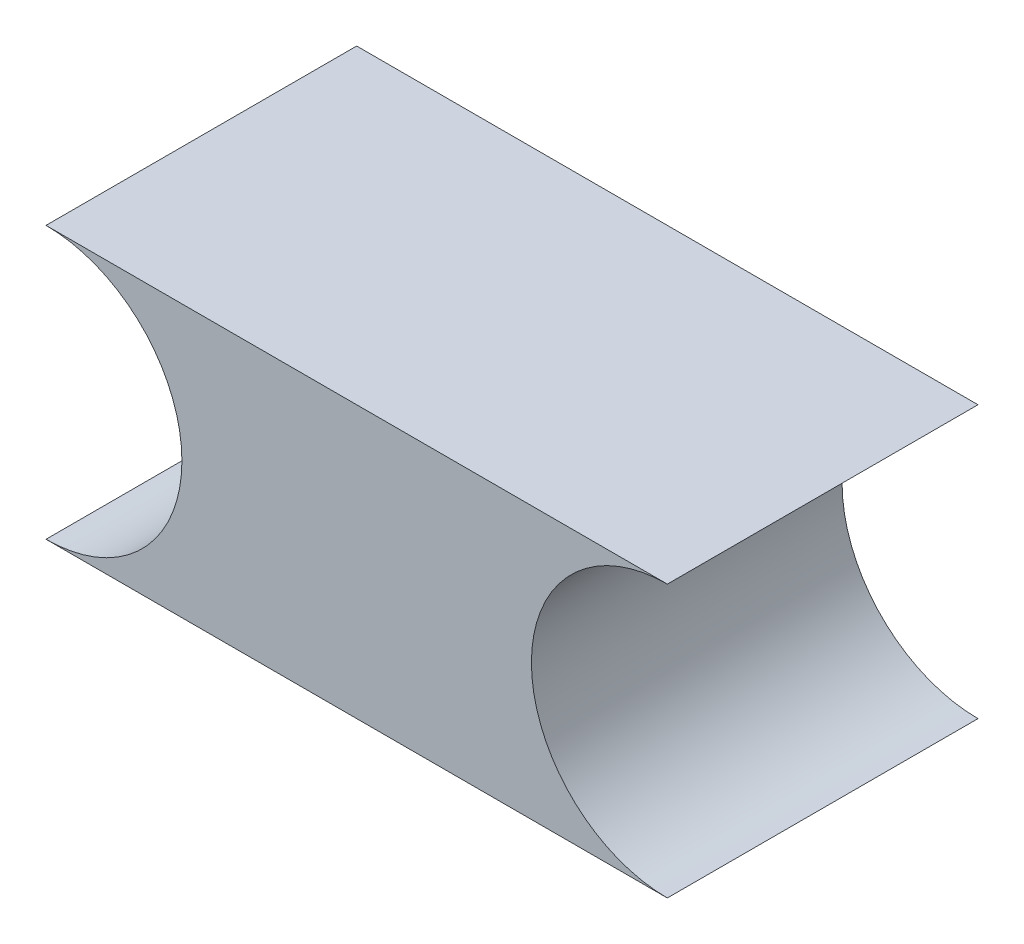
ISO-10303-21;
HEADER;
FILE_DESCRIPTION(('STEP AP214'),'2;1');
FILE_NAME('part.step','',(''),(''),'','','');
FILE_SCHEMA(('AUTOMOTIVE_DESIGN { 1 0 10303 214 1 1 1 1 }'));
ENDSEC;
DATA;
#1=APPLICATION_CONTEXT('core data for automotive mechanical design processes');
#2=APPLICATION_PROTOCOL_DEFINITION('international standard','automotive_design',2000,#1);
#3=PRODUCT_CONTEXT('',#1,'mechanical');
#4=PRODUCT('Part','Part','',(#3));
#5=PRODUCT_RELATED_PRODUCT_CATEGORY('part','',(#4));
#6=PRODUCT_DEFINITION_FORMATION('','',#4);
#7=PRODUCT_DEFINITION_CONTEXT('part definition',#1,'design');
#8=PRODUCT_DEFINITION('design','',#6,#7);
#9=PRODUCT_DEFINITION_SHAPE('','',#8);
#10=(LENGTH_UNIT() NAMED_UNIT(*) SI_UNIT(.MILLI.,.METRE.));
#11=(NAMED_UNIT(*) PLANE_ANGLE_UNIT() SI_UNIT($,.RADIAN.));
#12=(NAMED_UNIT(*) SI_UNIT($,.STERADIAN.) SOLID_ANGLE_UNIT());
#13=UNCERTAINTY_MEASURE_WITH_UNIT(LENGTH_MEASURE(1.E-05),#10,'distance_accuracy_value','');
#14=(GEOMETRIC_REPRESENTATION_CONTEXT(3) GLOBAL_UNCERTAINTY_ASSIGNED_CONTEXT((#13)) GLOBAL_UNIT_ASSIGNED_CONTEXT((#10,
#11,#12)) REPRESENTATION_CONTEXT('',''));
#15=CARTESIAN_POINT('',(0.,0.,0.));
#16=DIRECTION('',(0.,0.,1.));
#17=DIRECTION('',(1.,0.,0.));
#18=AXIS2_PLACEMENT_3D('',#15,#16,#17);
#19=CARTESIAN_POINT('',(-31.4851738903582,-6.17565445026179,80.));
#20=DIRECTION('',(0.,0.,-1.));
#21=DIRECTION('',(-1.,0.,0.));
#22=AXIS2_PLACEMENT_3D('',#19,#20,#21);
#23=CYLINDRICAL_SURFACE('',#22,35.);
#24=CARTESIAN_POINT('',(-31.4851738903582,-6.17565445026179,0.));
#25=DIRECTION('',(0.,0.,-1.));
#26=DIRECTION('',(1.,0.,0.));
#27=AXIS2_PLACEMENT_3D('',#24,#25,#26);
#28=CIRCLE('',#27,35.);
#29=CARTESIAN_POINT('',(-31.4851738903582,28.8243455497382,0.));
#30=VERTEX_POINT('',#29);
#31=CARTESIAN_POINT('',(-31.4851738903582,-41.1756544502618,0.));
#32=VERTEX_POINT('',#31);
#33=EDGE_CURVE('E96',#30,#32,#28,.T.);
#34=ORIENTED_EDGE('',*,*,#33,.T.);
#35=DIRECTION('',(0.,0.,-1.));
#36=VECTOR('',#35,1.);
#37=CARTESIAN_POINT('',(-31.4851738903582,-41.1756544502618,80.));
#38=LINE('',#37,#36);
#39=CARTESIAN_POINT('',(-31.4851738903582,-41.1756544502618,80.));
#40=VERTEX_POINT('',#39);
#41=EDGE_CURVE('E11',#40,#32,#38,.T.);
#42=ORIENTED_EDGE('',*,*,#41,.F.);
#43=CARTESIAN_POINT('',(-31.4851738903582,-6.17565445026179,80.));
#44=DIRECTION('',(0.,0.,-1.));
#45=DIRECTION('',(1.,0.,0.));
#46=AXIS2_PLACEMENT_3D('',#43,#44,#45);
#47=CIRCLE('',#46,35.);
#48=CARTESIAN_POINT('',(-31.4851738903582,28.8243455497382,80.));
#49=VERTEX_POINT('',#48);
#50=EDGE_CURVE('E84',#49,#40,#47,.T.);
#51=ORIENTED_EDGE('',*,*,#50,.F.);
#52=DIRECTION('',(0.,0.,-1.));
#53=VECTOR('',#52,1.);
#54=CARTESIAN_POINT('',(-31.4851738903582,28.8243455497382,80.));
#55=LINE('',#54,#53);
#56=EDGE_CURVE('E92',#49,#30,#55,.T.);
#57=ORIENTED_EDGE('',*,*,#56,.T.);
#58=EDGE_LOOP('',(#34,#42,#51,#57));
#59=FACE_BOUND('',#58,.T.);
#60=ADVANCED_FACE('F33',(#59),#23,.F.);
#61=CARTESIAN_POINT('',(-31.4851738903582,-41.1756544502618,80.));
#62=DIRECTION('',(0.,1.,0.));
#63=DIRECTION('',(0.,0.,1.));
#64=AXIS2_PLACEMENT_3D('',#61,#62,#63);
#65=PLANE('',#64);
#66=DIRECTION('',(1.,0.,0.));
#67=VECTOR('',#66,1.);
#68=CARTESIAN_POINT('',(-31.4851738903582,-41.1756544502618,0.));
#69=LINE('',#68,#67);
#70=CARTESIAN_POINT('',(128.514826109642,-41.1756544502618,0.));
#71=VERTEX_POINT('',#70);
#72=EDGE_CURVE('E88',#32,#71,#69,.T.);
#73=ORIENTED_EDGE('',*,*,#72,.T.);
#74=DIRECTION('',(0.,0.,-1.));
#75=VECTOR('',#74,1.);
#76=CARTESIAN_POINT('',(128.514826109642,-41.1756544502618,80.));
#77=LINE('',#76,#75);
#78=CARTESIAN_POINT('',(128.514826109642,-41.1756544502618,80.));
#79=VERTEX_POINT('',#78);
#80=EDGE_CURVE('E41',#79,#71,#77,.T.);
#81=ORIENTED_EDGE('',*,*,#80,.F.);
#82=DIRECTION('',(1.,0.,0.));
#83=VECTOR('',#82,1.);
#84=CARTESIAN_POINT('',(-31.4851738903582,-41.1756544502618,80.));
#85=LINE('',#84,#83);
#86=EDGE_CURVE('E79',#40,#79,#85,.T.);
#87=ORIENTED_EDGE('',*,*,#86,.F.);
#88=ORIENTED_EDGE('',*,*,#41,.T.);
#89=EDGE_LOOP('',(#73,#81,#87,#88));
#90=FACE_BOUND('',#89,.T.);
#91=ADVANCED_FACE('F87',(#90),#65,.F.);
#92=CARTESIAN_POINT('',(128.514826109642,-6.17565445026179,80.));
#93=DIRECTION('',(0.,0.,-1.));
#94=DIRECTION('',(-1.,0.,0.));
#95=AXIS2_PLACEMENT_3D('',#92,#93,#94);
#96=CYLINDRICAL_SURFACE('',#95,35.);
#97=CARTESIAN_POINT('',(128.514826109642,-6.17565445026179,0.));
#98=DIRECTION('',(0.,0.,-1.));
#99=DIRECTION('',(1.,0.,0.));
#100=AXIS2_PLACEMENT_3D('',#97,#98,#99);
#101=CIRCLE('',#100,35.);
#102=CARTESIAN_POINT('',(128.514826109642,28.8243455497382,0.));
#103=VERTEX_POINT('',#102);
#104=EDGE_CURVE('E66',#71,#103,#101,.T.);
#105=ORIENTED_EDGE('',*,*,#104,.T.);
#106=DIRECTION('',(0.,0.,-1.));
#107=VECTOR('',#106,1.);
#108=CARTESIAN_POINT('',(128.514826109642,28.8243455497382,80.));
#109=LINE('',#108,#107);
#110=CARTESIAN_POINT('',(128.514826109642,28.8243455497382,80.));
#111=VERTEX_POINT('',#110);
#112=EDGE_CURVE('E89',#111,#103,#109,.T.);
#113=ORIENTED_EDGE('',*,*,#112,.F.);
#114=CARTESIAN_POINT('',(128.514826109642,-6.17565445026179,80.));
#115=DIRECTION('',(0.,0.,-1.));
#116=DIRECTION('',(1.,0.,0.));
#117=AXIS2_PLACEMENT_3D('',#114,#115,#116);
#118=CIRCLE('',#117,35.);
#119=EDGE_CURVE('E82',#79,#111,#118,.T.);
#120=ORIENTED_EDGE('',*,*,#119,.F.);
#121=ORIENTED_EDGE('',*,*,#80,.T.);
#122=EDGE_LOOP('',(#105,#113,#120,#121));
#123=FACE_BOUND('',#122,.T.);
#124=ADVANCED_FACE('F90',(#123),#96,.F.);
#125=CARTESIAN_POINT('',(-31.4851738903582,28.8243455497382,80.));
#126=DIRECTION('',(0.,-1.,0.));
#127=DIRECTION('',(0.,0.,-1.));
#128=AXIS2_PLACEMENT_3D('',#125,#126,#127);
#129=PLANE('',#128);
#130=DIRECTION('',(-1.,0.,0.));
#131=VECTOR('',#130,1.);
#132=CARTESIAN_POINT('',(-31.4851738903582,28.8243455497382,0.));
#133=LINE('',#132,#131);
#134=EDGE_CURVE('E72',#103,#30,#133,.T.);
#135=ORIENTED_EDGE('',*,*,#134,.T.);
#136=ORIENTED_EDGE('',*,*,#56,.F.);
#137=DIRECTION('',(-1.,0.,0.));
#138=VECTOR('',#137,1.);
#139=CARTESIAN_POINT('',(-31.4851738903582,28.8243455497382,80.));
#140=LINE('',#139,#138);
#141=EDGE_CURVE('E49',#111,#49,#140,.T.);
#142=ORIENTED_EDGE('',*,*,#141,.F.);
#143=ORIENTED_EDGE('',*,*,#112,.T.);
#144=EDGE_LOOP('',(#135,#136,#142,#143));
#145=FACE_BOUND('',#144,.T.);
#146=ADVANCED_FACE('F103',(#145),#129,.F.);
#147=CARTESIAN_POINT('',(-31.4851738903582,-6.17565445026179,80.));
#148=DIRECTION('',(0.,0.,1.));
#149=DIRECTION('',(1.,0.,0.));
#150=AXIS2_PLACEMENT_3D('',#147,#148,#149);
#151=PLANE('',#150);
#152=ORIENTED_EDGE('',*,*,#50,.T.);
#153=ORIENTED_EDGE('',*,*,#86,.T.);
#154=ORIENTED_EDGE('',*,*,#119,.T.);
#155=ORIENTED_EDGE('',*,*,#141,.T.);
#156=EDGE_LOOP('',(#152,#153,#154,#155));
#157=FACE_BOUND('',#156,.T.);
#158=ADVANCED_FACE('F80',(#157),#151,.T.);
#159=CARTESIAN_POINT('',(-31.4851738903582,-6.17565445026179,0.));
#160=DIRECTION('',(0.,0.,1.));
#161=DIRECTION('',(1.,0.,0.));
#162=AXIS2_PLACEMENT_3D('',#159,#160,#161);
#163=PLANE('',#162);
#164=ORIENTED_EDGE('',*,*,#33,.F.);
#165=ORIENTED_EDGE('',*,*,#134,.F.);
#166=ORIENTED_EDGE('',*,*,#104,.F.);
#167=ORIENTED_EDGE('',*,*,#72,.F.);
#168=EDGE_LOOP('',(#164,#165,#166,#167));
#169=FACE_BOUND('',#168,.T.);
#170=ADVANCED_FACE('F106',(#169),#163,.F.);
#171=CLOSED_SHELL('',(#60,#91,#124,#146,#158,#170));
#172=MANIFOLD_SOLID_BREP('B2',#171);
#173=ADVANCED_BREP_SHAPE_REPRESENTATION('',(#18,#172),#14);
#174=SHAPE_DEFINITION_REPRESENTATION(#9,#173);
ENDSEC;
END-ISO-10303-21;
